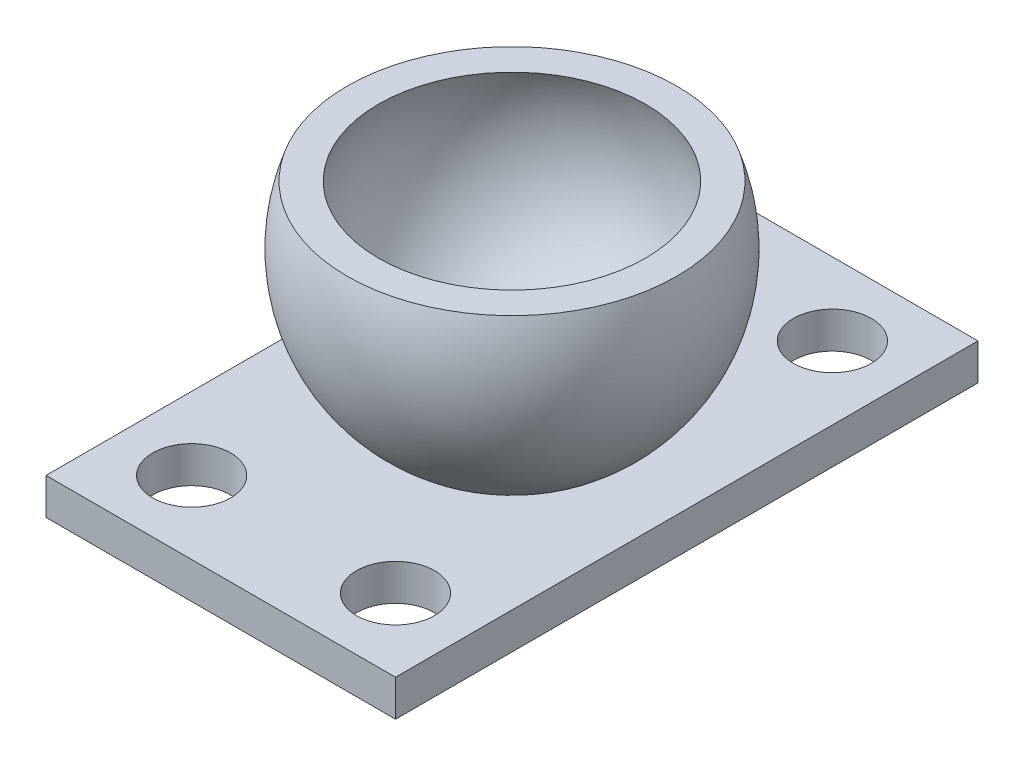
ISO-10303-21;
HEADER;
FILE_DESCRIPTION(('STEP AP214'),'2;1');
FILE_NAME('part.step','',(''),(''),'','','');
FILE_SCHEMA(('AUTOMOTIVE_DESIGN { 1 0 10303 214 1 1 1 1 }'));
ENDSEC;
DATA;
#1=APPLICATION_CONTEXT('core data for automotive mechanical design processes');
#2=APPLICATION_PROTOCOL_DEFINITION('international standard','automotive_design',2000,#1);
#3=PRODUCT_CONTEXT('',#1,'mechanical');
#4=PRODUCT('Part','Part','',(#3));
#5=PRODUCT_RELATED_PRODUCT_CATEGORY('part','',(#4));
#6=PRODUCT_DEFINITION_FORMATION('','',#4);
#7=PRODUCT_DEFINITION_CONTEXT('part definition',#1,'design');
#8=PRODUCT_DEFINITION('design','',#6,#7);
#9=PRODUCT_DEFINITION_SHAPE('','',#8);
#10=(LENGTH_UNIT() NAMED_UNIT(*) SI_UNIT(.MILLI.,.METRE.));
#11=(NAMED_UNIT(*) PLANE_ANGLE_UNIT() SI_UNIT($,.RADIAN.));
#12=(NAMED_UNIT(*) SI_UNIT($,.STERADIAN.) SOLID_ANGLE_UNIT());
#13=UNCERTAINTY_MEASURE_WITH_UNIT(LENGTH_MEASURE(1.E-05),#10,'distance_accuracy_value','');
#14=(GEOMETRIC_REPRESENTATION_CONTEXT(3) GLOBAL_UNCERTAINTY_ASSIGNED_CONTEXT((#13)) GLOBAL_UNIT_ASSIGNED_CONTEXT((#10,
#11,#12)) REPRESENTATION_CONTEXT('',''));
#15=CARTESIAN_POINT('',(0.,0.,0.));
#16=DIRECTION('',(0.,0.,1.));
#17=DIRECTION('',(1.,0.,0.));
#18=AXIS2_PLACEMENT_3D('',#15,#16,#17);
#19=CARTESIAN_POINT('',(0.,0.,0.));
#20=DIRECTION('',(0.,1.,0.));
#21=DIRECTION('',(1.,0.,0.));
#22=AXIS2_PLACEMENT_3D('',#19,#20,#21);
#23=SPHERICAL_SURFACE('',#22,7.62);
#24=CARTESIAN_POINT('',(0.,2.54,0.));
#25=DIRECTION('',(0.,-1.,0.));
#26=DIRECTION('',(0.,0.,-1.));
#27=AXIS2_PLACEMENT_3D('',#24,#25,#26);
#28=CIRCLE('',#27,7.18420489685532);
#29=CARTESIAN_POINT('',(7.18420489685532,2.54,0.));
#30=VERTEX_POINT('',#29);
#31=EDGE_CURVE('E41',#30,#30,#28,.T.);
#32=CARTESIAN_POINT('',(0.,-6.0325,0.));
#33=DIRECTION('',(0.,-1.,0.));
#34=DIRECTION('',(0.,0.,-1.));
#35=AXIS2_PLACEMENT_3D('',#32,#33,#34);
#36=CIRCLE('',#35,4.65546385981032);
#37=CARTESIAN_POINT('',(4.65546385981032,-6.0325,0.));
#38=VERTEX_POINT('',#37);
#39=EDGE_CURVE('E11',#38,#38,#36,.T.);
#40=CARTESIAN_POINT('',(7.18420489685532,2.54,0.));
#41=CARTESIAN_POINT('',(7.21736797864051,2.44620385762288,0.));
#42=CARTESIAN_POINT('',(7.24869215006212,2.35175763946825,0.));
#43=CARTESIAN_POINT('',(7.30761912540713,2.16171132039475,0.));
#44=CARTESIAN_POINT('',(7.33522192933052,2.06611121947588,0.));
#45=CARTESIAN_POINT('',(7.38666262290797,1.87390340366473,0.));
#46=CARTESIAN_POINT('',(7.41050051256203,1.77729568877244,0.));
#47=CARTESIAN_POINT('',(7.45437513543213,1.58322093366377,0.));
#48=CARTESIAN_POINT('',(7.47441186864817,1.48575389344739,0.));
#49=CARTESIAN_POINT('',(7.51065335730442,1.29010996739783,0.));
#50=CARTESIAN_POINT('',(7.52685811274463,1.19193308156466,0.));
#51=CARTESIAN_POINT('',(7.55541081227081,0.995020066884962,0.));
#52=CARTESIAN_POINT('',(7.56775875635677,0.896283938038443,0.));
#53=CARTESIAN_POINT('',(7.58857888620803,0.698403888645334,0.));
#54=CARTESIAN_POINT('',(7.59705107197332,0.599259968098743,0.));
#55=CARTESIAN_POINT('',(7.61010669120119,0.400716414582973,0.));
#56=CARTESIAN_POINT('',(7.61469012466378,0.301316781613794,0.));
#57=CARTESIAN_POINT('',(7.61996120822331,0.102414274117462,0.));
#58=CARTESIAN_POINT('',(7.62064885832025,0.00291139959030922,0.));
#59=CARTESIAN_POINT('',(7.61812732046847,-0.196044961617627,0.));
#60=CARTESIAN_POINT('',(7.61491813251974,-0.295498448298411,0.));
#61=CARTESIAN_POINT('',(7.60460784117947,-0.494203480213263,0.));
#62=CARTESIAN_POINT('',(7.59750673778794,-0.593455025447331,0.));
#63=CARTESIAN_POINT('',(7.57942350808932,-0.79160393061766,0.));
#64=CARTESIAN_POINT('',(7.56844138178224,-0.89050129055392,0.));
#65=CARTESIAN_POINT('',(7.54261295194434,-1.08779012457254,0.));
#66=CARTESIAN_POINT('',(7.52776664841354,-1.1861815986549,0.));
#67=CARTESIAN_POINT('',(7.49423263715848,-1.38230773639673,0.));
#68=CARTESIAN_POINT('',(7.47554492943423,-1.48004240005619,0.));
#69=CARTESIAN_POINT('',(7.43435677522536,-1.6747049998776,0.));
#70=CARTESIAN_POINT('',(7.41185632874073,-1.77163293603953,0.));
#71=CARTESIAN_POINT('',(7.36307721087747,-1.96453340124594,0.));
#72=CARTESIAN_POINT('',(7.33679853949883,-2.06050593029042,0.));
#73=CARTESIAN_POINT('',(7.28050328120545,-2.25134836715928,0.));
#74=CARTESIAN_POINT('',(7.25048669429071,-2.34621827498368,0.));
#75=CARTESIAN_POINT('',(7.18676164794341,-2.53470994664161,0.));
#76=CARTESIAN_POINT('',(7.15305318851084,-2.62833171047514,0.));
#77=CARTESIAN_POINT('',(7.08199610318013,-2.81418348593254,0.));
#78=CARTESIAN_POINT('',(7.04464747728199,-2.9064134975564,0.));
#79=CARTESIAN_POINT('',(6.96636734879371,-3.08934029521119,0.));
#80=CARTESIAN_POINT('',(6.92543584620356,-3.18003708124213,0.));
#81=CARTESIAN_POINT('',(6.84005274994753,-3.35975830617133,0.));
#82=CARTESIAN_POINT('',(6.79560115628166,-3.44878274506959,0.));
#83=CARTESIAN_POINT('',(6.70324606302764,-3.6250227194414,0.));
#84=CARTESIAN_POINT('',(6.65534256343949,-3.71223825491493,0.));
#85=CARTESIAN_POINT('',(6.55615713843175,-3.88472664084812,0.));
#86=CARTESIAN_POINT('',(6.50487521301215,-3.96999949130777,0.));
#87=CARTESIAN_POINT('',(6.39901159869178,-4.13847170557846,0.));
#88=CARTESIAN_POINT('',(6.34442990979101,-4.2216710693895,0.));
#89=CARTESIAN_POINT('',(6.23205049232719,-4.38586868916735,0.));
#90=CARTESIAN_POINT('',(6.17425276376414,-4.46686694513417,0.));
#91=CARTESIAN_POINT('',(6.05552992431975,-4.62653810480414,0.));
#92=CARTESIAN_POINT('',(5.99460481343841,-4.7052110085073,0.));
#93=CARTESIAN_POINT('',(5.86972066243425,-4.86011078443617,0.));
#94=CARTESIAN_POINT('',(5.80576162231144,-4.93633765666188,0.));
#95=CARTESIAN_POINT('',(5.67490772499867,-5.08622844876912,0.));
#96=CARTESIAN_POINT('',(5.60801286780871,-5.15989236865066,0.));
#97=CARTESIAN_POINT('',(5.47138993207991,-5.30454424293146,0.));
#98=CARTESIAN_POINT('',(5.40166185354106,-5.37553219733073,0.));
#99=CARTESIAN_POINT('',(5.25947949051871,-5.51472332042364,0.));
#100=CARTESIAN_POINT('',(5.18702520603521,-5.58292648911727,0.));
#101=CARTESIAN_POINT('',(5.03950135305579,-5.71644316304503,0.));
#102=CARTESIAN_POINT('',(4.96443178455988,-5.78175666827915,0.));
#103=CARTESIAN_POINT('',(4.81179332437503,-5.90939479851104,0.));
#104=CARTESIAN_POINT('',(4.73422443268609,-5.97171942350882,0.));
#105=CARTESIAN_POINT('',(4.65546385981032,-6.0325,0.));
#106=B_SPLINE_CURVE_WITH_KNOTS('',3,(#40,#41,#42,#43,#44,#45,#46,#47,#48,#49,#50,#51,#52,#53,
#54,#55,#56,#57,#58,#59,#60,#61,#62,#63,#64,#65,#66,#67,#68,#69,#70,#71,#72,#73,#74,#75,#76,#77,
#78,#79,#80,#81,#82,#83,#84,#85,#86,#87,#88,#89,#90,#91,#92,#93,#94,#95,#96,#97,#98,#99,#100,
#101,#102,#103,#104,#105),.UNSPECIFIED.,.F.,.F.,(4,2,2,2,2,2,2,2,2,2,2,2,2,2,2,2,2,2,2,2,2,2,2,
2,2,2,2,2,2,2,2,2,4),(0.,0.298439435349034,0.596878870698068,0.895318306047103,1.19375774139614,
1.49219717674517,1.79063661209421,2.08907604744324,2.38751548279227,2.68595491814131,
2.98439435349034,3.28283378883938,3.58127322418841,3.87971265953745,4.17815209488648,
4.47659153023552,4.77503096558455,5.07347040093358,5.37190983628262,5.67034927163165,
5.96878870698068,6.26722814232972,6.56566757767875,6.86410701302779,7.16254644837682,
7.46098588372586,7.75942531907489,8.05786475442392,8.35630418977296,8.65474362512199,
8.95318306047103,9.25162249582006,9.5500619311691),.UNSPECIFIED.);
#107=EDGE_CURVE('BSEAM33',#30,#38,#106,.T.);
#108=ORIENTED_EDGE('',*,*,#31,.T.);
#109=ORIENTED_EDGE('',*,*,#39,.F.);
#110=ORIENTED_EDGE('',*,*,#107,.T.);
#111=ORIENTED_EDGE('',*,*,#107,.F.);
#112=EDGE_LOOP('',(#108,#110,#109,#111));
#113=FACE_BOUND('',#112,.T.);
#114=ADVANCED_FACE('F33',(#113),#23,.T.);
#115=CARTESIAN_POINT('',(0.,0.,0.));
#116=DIRECTION('',(0.,1.,0.));
#117=DIRECTION('',(1.,0.,0.));
#118=AXIS2_PLACEMENT_3D('',#115,#116,#117);
#119=SPHERICAL_SURFACE('',#118,6.35);
#120=CARTESIAN_POINT('',(0.,2.54,0.));
#121=DIRECTION('',(0.,-1.,0.));
#122=DIRECTION('',(0.,0.,-1.));
#123=AXIS2_PLACEMENT_3D('',#120,#121,#122);
#124=CIRCLE('',#123,5.81987113259392);
#125=CARTESIAN_POINT('',(5.81987113259392,2.54,0.));
#126=VERTEX_POINT('',#125);
#127=EDGE_CURVE('E116',#126,#126,#124,.T.);
#128=CARTESIAN_POINT('',(0.,-6.0325,0.));
#129=DIRECTION('',(0.,-1.,0.));
#130=DIRECTION('',(0.,0.,-1.));
#131=AXIS2_PLACEMENT_3D('',#128,#129,#130);
#132=CIRCLE('',#131,1.98278686449149);
#133=CARTESIAN_POINT('',(1.98278686449149,-6.0325,0.));
#134=VERTEX_POINT('',#133);
#135=EDGE_CURVE('E36',#134,#134,#132,.T.);
#136=CARTESIAN_POINT('',(5.81987113259392,2.54,0.));
#137=CARTESIAN_POINT('',(5.86392031976895,2.43907758312545,0.));
#138=CARTESIAN_POINT('',(5.90533920572225,2.33700748226285,0.));
#139=CARTESIAN_POINT('',(5.98281574346039,2.13085239739143,0.));
#140=CARTESIAN_POINT('',(6.01887339524525,2.02676741338262,0.));
#141=CARTESIAN_POINT('',(6.08552683292156,1.81686304704869,0.));
#142=CARTESIAN_POINT('',(6.11612261881302,1.71104366472358,0.));
#143=CARTESIAN_POINT('',(6.17177035893245,1.4979571404296,0.));
#144=CARTESIAN_POINT('',(6.19682231316042,1.39068999846072,0.));
#145=CARTESIAN_POINT('',(6.2413143833568,1.1749981195208,0.));
#146=CARTESIAN_POINT('',(6.26075449932521,1.06657338254976,0.));
#147=CARTESIAN_POINT('',(6.29397035020064,0.848859715393923,0.));
#148=CARTESIAN_POINT('',(6.30774608510765,0.739570785209135,0.));
#149=CARTESIAN_POINT('',(6.32959588316977,0.520424443676335,0.));
#150=CARTESIAN_POINT('',(6.33766994632487,0.410567032328323,0.));
#151=CARTESIAN_POINT('',(6.34809455802168,0.190580986267072,0.));
#152=CARTESIAN_POINT('',(6.35044510656338,0.0804523515538311,0.));
#153=CARTESIAN_POINT('',(6.3494163276985,-0.139778151571515,0.));
#154=CARTESIAN_POINT('',(6.34603700029191,-0.249880019983621,0.));
#155=CARTESIAN_POINT('',(6.33355761374231,-0.469759072724919,0.));
#156=CARTESIAN_POINT('',(6.32445755459929,-0.579536257054111,0.));
#157=CARTESIAN_POINT('',(6.30056132776863,-0.798468902534753,0.));
#158=CARTESIAN_POINT('',(6.28576516008099,-0.907624363686202,0.));
#159=CARTESIAN_POINT('',(6.25051675219531,-1.12501820595905,0.));
#160=CARTESIAN_POINT('',(6.23006451199725,-1.23325658708045,0.));
#161=CARTESIAN_POINT('',(6.18355929950538,-1.44852339392004,0.));
#162=CARTESIAN_POINT('',(6.15750632721155,-1.55555181963821,0.));
#163=CARTESIAN_POINT('',(6.09987014561621,-1.76810911423703,0.));
#164=CARTESIAN_POINT('',(6.06828693631469,-1.87363798311766,0.));
#165=CARTESIAN_POINT('',(5.99967573970785,-2.08291062016362,0.));
#166=CARTESIAN_POINT('',(5.96264775240252,-2.18665438832894,0.));
#167=CARTESIAN_POINT('',(5.88324719147222,-2.39207611025718,0.));
#168=CARTESIAN_POINT('',(5.84087461784725,-2.4937540640201,0.));
#169=CARTESIAN_POINT('',(5.75089953753902,-2.69476903321278,0.));
#170=CARTESIAN_POINT('',(5.70329703085576,-2.79410604864253,0.));
#171=CARTESIAN_POINT('',(5.60299088903681,-2.99017035143477,0.));
#172=CARTESIAN_POINT('',(5.55028725390112,-3.08689763879726,0.));
#173=CARTESIAN_POINT('',(5.4399214626032,-3.27748075721853,0.));
#174=CARTESIAN_POINT('',(5.38225930644099,-3.37133658827731,0.));
#175=CARTESIAN_POINT('',(5.26213249746397,-3.55592283554686,0.));
#176=CARTESIAN_POINT('',(5.19966784464916,-3.64665325175764,0.));
#177=CARTESIAN_POINT('',(5.07010506151141,-3.82474316764684,0.));
#178=CARTESIAN_POINT('',(5.00300693118847,-3.91210266732528,0.));
#179=CARTESIAN_POINT('',(4.86435874961491,-4.08321436962226,0.));
#180=CARTESIAN_POINT('',(4.79280869836428,-4.16696657224081,0.));
#181=CARTESIAN_POINT('',(4.64545027767578,-4.3306370606194,0.));
#182=CARTESIAN_POINT('',(4.56964190823791,-4.41055534637944,0.));
#183=CARTESIAN_POINT('',(4.41397197626852,-4.56634175529791,0.));
#184=CARTESIAN_POINT('',(4.334110413737,-4.64220987845633,0.));
#185=CARTESIAN_POINT('',(4.17055018780346,-4.78969067512276,0.));
#186=CARTESIAN_POINT('',(4.08685152440143,-4.86130334863076,0.));
#187=CARTESIAN_POINT('',(3.91584357207322,-5.0000794749321,0.));
#188=CARTESIAN_POINT('',(3.82853428314703,-5.06724292772543,0.));
#189=CARTESIAN_POINT('',(3.65054132280778,-5.19693887504929,0.));
#190=CARTESIAN_POINT('',(3.55985765139471,-5.25947136957983,0.));
#191=CARTESIAN_POINT('',(3.37536130737882,-5.37973621340623,0.));
#192=CARTESIAN_POINT('',(3.281548634776,-5.43746856270211,0.));
#193=CARTESIAN_POINT('',(3.09104810738704,-5.54797684300508,0.));
#194=CARTESIAN_POINT('',(2.9943602526009,-5.60075277401217,0.));
#195=CARTESIAN_POINT('',(2.79837106731956,-5.70120563394583,0.));
#196=CARTESIAN_POINT('',(2.69906973682437,-5.74888256287239,0.));
#197=CARTESIAN_POINT('',(2.49812197631587,-5.83900759439379,0.));
#198=CARTESIAN_POINT('',(2.39647554630257,-5.88145569698864,0.));
#199=CARTESIAN_POINT('',(2.19111380839673,-5.96101127204487,0.));
#200=CARTESIAN_POINT('',(2.0873985005042,-5.99811874450624,0.));
#201=CARTESIAN_POINT('',(1.98278686449149,-6.0325,0.));
#202=B_SPLINE_CURVE_WITH_KNOTS('',3,(#136,#137,#138,#139,#140,#141,#142,#143,#144,#145,#146,
#147,#148,#149,#150,#151,#152,#153,#154,#155,#156,#157,#158,#159,#160,#161,#162,#163,#164,#165,
#166,#167,#168,#169,#170,#171,#172,#173,#174,#175,#176,#177,#178,#179,#180,#181,#182,#183,#184,
#185,#186,#187,#188,#189,#190,#191,#192,#193,#194,#195,#196,#197,#198,#199,#200,#201),
.UNSPECIFIED.,.F.,.F.,(4,2,2,2,2,2,2,2,2,2,2,2,2,2,2,2,2,2,2,2,2,2,2,2,2,2,2,2,2,2,2,2,4),(0.,
0.330312120768517,0.660624241537033,0.990936362305549,1.32124848307407,1.65156060384258,
1.9818727246111,2.31218484537962,2.64249696614813,2.97280908691665,3.30312120768517,
3.63343332845368,3.9637454492222,4.29405756999071,4.62436969075923,4.95468181152775,
5.28499393229626,5.61530605306478,5.9456181738333,6.27593029460181,6.60624241537033,
6.93655453613885,7.26686665690736,7.59717877767588,7.92749089844439,8.25780301921291,
8.58811513998143,8.91842726074994,9.24873938151846,9.57905150228698,9.9093636230555,
10.239675743824,10.5699878645925),.UNSPECIFIED.);
#203=EDGE_CURVE('BSEAM126',#126,#134,#202,.T.);
#204=ORIENTED_EDGE('',*,*,#127,.F.);
#205=ORIENTED_EDGE('',*,*,#135,.T.);
#206=ORIENTED_EDGE('',*,*,#203,.T.);
#207=ORIENTED_EDGE('',*,*,#203,.F.);
#208=EDGE_LOOP('',(#204,#206,#205,#207));
#209=FACE_BOUND('',#208,.T.);
#210=ADVANCED_FACE('F126',(#209),#119,.F.);
#211=CARTESIAN_POINT('',(-8.89,2.54,-12.7));
#212=DIRECTION('',(0.,-1.,0.));
#213=DIRECTION('',(0.,0.,-1.));
#214=AXIS2_PLACEMENT_3D('',#211,#212,#213);
#215=PLANE('',#214);
#216=ORIENTED_EDGE('',*,*,#127,.T.);
#217=EDGE_LOOP('',(#216));
#218=FACE_BOUND('',#217,.T.);
#219=ORIENTED_EDGE('',*,*,#31,.F.);
#220=EDGE_LOOP('',(#219));
#221=FACE_BOUND('',#220,.T.);
#222=ADVANCED_FACE('F123',(#218,#221),#215,.F.);
#223=CARTESIAN_POINT('',(0.,-6.0325,0.));
#224=DIRECTION('',(0.,-1.,0.));
#225=DIRECTION('',(0.,0.,-1.));
#226=AXIS2_PLACEMENT_3D('',#223,#224,#225);
#227=PLANE('',#226);
#228=ORIENTED_EDGE('',*,*,#135,.F.);
#229=EDGE_LOOP('',(#228));
#230=FACE_BOUND('',#229,.T.);
#231=ADVANCED_FACE('F125',(#230),#227,.F.);
#232=CARTESIAN_POINT('',(-7.62,-6.0325,12.7));
#233=DIRECTION('',(1.,0.,0.));
#234=DIRECTION('',(0.,0.,-1.));
#235=AXIS2_PLACEMENT_3D('',#232,#233,#234);
#236=PLANE('',#235);
#237=DIRECTION('',(0.,0.,1.));
#238=VECTOR('',#237,1.);
#239=CARTESIAN_POINT('',(-7.62,-7.62,12.7));
#240=LINE('',#239,#238);
#241=CARTESIAN_POINT('',(-7.62,-7.62,-12.7));
#242=VERTEX_POINT('',#241);
#243=CARTESIAN_POINT('',(-7.62,-7.62,12.7));
#244=VERTEX_POINT('',#243);
#245=EDGE_CURVE('E105',#242,#244,#240,.T.);
#246=ORIENTED_EDGE('',*,*,#245,.T.);
#247=DIRECTION('',(0.,-1.,0.));
#248=VECTOR('',#247,1.);
#249=CARTESIAN_POINT('',(-7.62,-6.0325,12.7));
#250=LINE('',#249,#248);
#251=CARTESIAN_POINT('',(-7.62,-6.0325,12.7));
#252=VERTEX_POINT('',#251);
#253=EDGE_CURVE('E96',#252,#244,#250,.T.);
#254=ORIENTED_EDGE('',*,*,#253,.F.);
#255=DIRECTION('',(0.,0.,1.));
#256=VECTOR('',#255,1.);
#257=CARTESIAN_POINT('',(-7.62,-6.0325,12.7));
#258=LINE('',#257,#256);
#259=CARTESIAN_POINT('',(-7.62,-6.0325,-12.7));
#260=VERTEX_POINT('',#259);
#261=EDGE_CURVE('E87',#260,#252,#258,.T.);
#262=ORIENTED_EDGE('',*,*,#261,.F.);
#263=DIRECTION('',(0.,-1.,0.));
#264=VECTOR('',#263,1.);
#265=CARTESIAN_POINT('',(-7.62,-6.0325,-12.7));
#266=LINE('',#265,#264);
#267=EDGE_CURVE('E101',#260,#242,#266,.T.);
#268=ORIENTED_EDGE('',*,*,#267,.T.);
#269=EDGE_LOOP('',(#246,#254,#262,#268));
#270=FACE_BOUND('',#269,.T.);
#271=ADVANCED_FACE('F132',(#270),#236,.F.);
#272=CARTESIAN_POINT('',(-7.62,-6.0325,12.7));
#273=DIRECTION('',(0.,0.,-1.));
#274=DIRECTION('',(-1.,0.,0.));
#275=AXIS2_PLACEMENT_3D('',#272,#273,#274);
#276=PLANE('',#275);
#277=DIRECTION('',(1.,0.,0.));
#278=VECTOR('',#277,1.);
#279=CARTESIAN_POINT('',(-7.62,-7.62,12.7));
#280=LINE('',#279,#278);
#281=CARTESIAN_POINT('',(7.62,-7.62,12.7));
#282=VERTEX_POINT('',#281);
#283=EDGE_CURVE('E93',#244,#282,#280,.T.);
#284=ORIENTED_EDGE('',*,*,#283,.T.);
#285=DIRECTION('',(0.,-1.,0.));
#286=VECTOR('',#285,1.);
#287=CARTESIAN_POINT('',(7.62,-6.0325,12.7));
#288=LINE('',#287,#286);
#289=CARTESIAN_POINT('',(7.62,-6.0325,12.7));
#290=VERTEX_POINT('',#289);
#291=EDGE_CURVE('E91',#290,#282,#288,.T.);
#292=ORIENTED_EDGE('',*,*,#291,.F.);
#293=DIRECTION('',(1.,0.,0.));
#294=VECTOR('',#293,1.);
#295=CARTESIAN_POINT('',(-7.62,-6.0325,12.7));
#296=LINE('',#295,#294);
#297=EDGE_CURVE('E81',#252,#290,#296,.T.);
#298=ORIENTED_EDGE('',*,*,#297,.F.);
#299=ORIENTED_EDGE('',*,*,#253,.T.);
#300=EDGE_LOOP('',(#284,#292,#298,#299));
#301=FACE_BOUND('',#300,.T.);
#302=ADVANCED_FACE('F92',(#301),#276,.F.);
#303=CARTESIAN_POINT('',(7.62,-6.0325,12.7));
#304=DIRECTION('',(-1.,0.,0.));
#305=DIRECTION('',(0.,0.,1.));
#306=AXIS2_PLACEMENT_3D('',#303,#304,#305);
#307=PLANE('',#306);
#308=DIRECTION('',(0.,0.,-1.));
#309=VECTOR('',#308,1.);
#310=CARTESIAN_POINT('',(7.62,-7.62,12.7));
#311=LINE('',#310,#309);
#312=CARTESIAN_POINT('',(7.62,-7.62,-12.7));
#313=VERTEX_POINT('',#312);
#314=EDGE_CURVE('E110',#282,#313,#311,.T.);
#315=ORIENTED_EDGE('',*,*,#314,.T.);
#316=DIRECTION('',(0.,-1.,0.));
#317=VECTOR('',#316,1.);
#318=CARTESIAN_POINT('',(7.62,-6.0325,-12.7));
#319=LINE('',#318,#317);
#320=CARTESIAN_POINT('',(7.62,-6.0325,-12.7));
#321=VERTEX_POINT('',#320);
#322=EDGE_CURVE('E97',#321,#313,#319,.T.);
#323=ORIENTED_EDGE('',*,*,#322,.F.);
#324=DIRECTION('',(0.,0.,-1.));
#325=VECTOR('',#324,1.);
#326=CARTESIAN_POINT('',(7.62,-6.0325,12.7));
#327=LINE('',#326,#325);
#328=EDGE_CURVE('E84',#290,#321,#327,.T.);
#329=ORIENTED_EDGE('',*,*,#328,.F.);
#330=ORIENTED_EDGE('',*,*,#291,.T.);
#331=EDGE_LOOP('',(#315,#323,#329,#330));
#332=FACE_BOUND('',#331,.T.);
#333=ADVANCED_FACE('F99',(#332),#307,.F.);
#334=CARTESIAN_POINT('',(-7.62,-6.0325,-12.7));
#335=DIRECTION('',(0.,0.,1.));
#336=DIRECTION('',(1.,0.,0.));
#337=AXIS2_PLACEMENT_3D('',#334,#335,#336);
#338=PLANE('',#337);
#339=DIRECTION('',(-1.,0.,0.));
#340=VECTOR('',#339,1.);
#341=CARTESIAN_POINT('',(-7.62,-7.62,-12.7));
#342=LINE('',#341,#340);
#343=EDGE_CURVE('E73',#313,#242,#342,.T.);
#344=ORIENTED_EDGE('',*,*,#343,.T.);
#345=ORIENTED_EDGE('',*,*,#267,.F.);
#346=DIRECTION('',(-1.,0.,0.));
#347=VECTOR('',#346,1.);
#348=CARTESIAN_POINT('',(-7.62,-6.0325,-12.7));
#349=LINE('',#348,#347);
#350=EDGE_CURVE('E53',#321,#260,#349,.T.);
#351=ORIENTED_EDGE('',*,*,#350,.F.);
#352=ORIENTED_EDGE('',*,*,#322,.T.);
#353=EDGE_LOOP('',(#344,#345,#351,#352));
#354=FACE_BOUND('',#353,.T.);
#355=ADVANCED_FACE('F178',(#354),#338,.F.);
#356=CARTESIAN_POINT('',(-4.445,-6.0325,9.525));
#357=DIRECTION('',(0.,1.,0.));
#358=DIRECTION('',(0.,0.,1.));
#359=AXIS2_PLACEMENT_3D('',#356,#357,#358);
#360=CIRCLE('',#359,1.7);
#361=CARTESIAN_POINT('',(-4.445,-6.0325,11.225));
#362=VERTEX_POINT('',#361);
#363=EDGE_CURVE('E254',#362,#362,#360,.T.);
#364=ORIENTED_EDGE('',*,*,#363,.F.);
#365=EDGE_LOOP('',(#364));
#366=FACE_BOUND('',#365,.T.);
#367=CARTESIAN_POINT('',(-4.445,-6.0325,-9.525));
#368=DIRECTION('',(0.,1.,0.));
#369=DIRECTION('',(0.,0.,1.));
#370=AXIS2_PLACEMENT_3D('',#367,#368,#369);
#371=CIRCLE('',#370,1.7);
#372=CARTESIAN_POINT('',(-4.445,-6.0325,-7.825));
#373=VERTEX_POINT('',#372);
#374=EDGE_CURVE('E256',#373,#373,#371,.T.);
#375=ORIENTED_EDGE('',*,*,#374,.F.);
#376=EDGE_LOOP('',(#375));
#377=FACE_BOUND('',#376,.T.);
#378=CARTESIAN_POINT('',(4.445,-6.0325,-9.525));
#379=DIRECTION('',(0.,1.,0.));
#380=DIRECTION('',(0.,0.,1.));
#381=AXIS2_PLACEMENT_3D('',#378,#379,#380);
#382=CIRCLE('',#381,1.7);
#383=CARTESIAN_POINT('',(4.445,-6.0325,-7.825));
#384=VERTEX_POINT('',#383);
#385=EDGE_CURVE('E264',#384,#384,#382,.T.);
#386=ORIENTED_EDGE('',*,*,#385,.F.);
#387=EDGE_LOOP('',(#386));
#388=FACE_BOUND('',#387,.T.);
#389=CARTESIAN_POINT('',(4.445,-6.0325,9.525));
#390=DIRECTION('',(0.,1.,0.));
#391=DIRECTION('',(0.,0.,1.));
#392=AXIS2_PLACEMENT_3D('',#389,#390,#391);
#393=CIRCLE('',#392,1.7);
#394=CARTESIAN_POINT('',(4.445,-6.0325,11.225));
#395=VERTEX_POINT('',#394);
#396=EDGE_CURVE('E270',#395,#395,#393,.T.);
#397=ORIENTED_EDGE('',*,*,#396,.F.);
#398=EDGE_LOOP('',(#397));
#399=FACE_BOUND('',#398,.T.);
#400=ORIENTED_EDGE('',*,*,#39,.T.);
#401=EDGE_LOOP('',(#400));
#402=FACE_BOUND('',#401,.T.);
#403=ORIENTED_EDGE('',*,*,#261,.T.);
#404=ORIENTED_EDGE('',*,*,#297,.T.);
#405=ORIENTED_EDGE('',*,*,#328,.T.);
#406=ORIENTED_EDGE('',*,*,#350,.T.);
#407=EDGE_LOOP('',(#403,#404,#405,#406));
#408=FACE_BOUND('',#407,.T.);
#409=ADVANCED_FACE('F82',(#366,#377,#388,#399,#402,#408),#227,.F.);
#410=CARTESIAN_POINT('',(0.,-7.62,0.));
#411=DIRECTION('',(0.,-1.,0.));
#412=DIRECTION('',(0.,0.,-1.));
#413=AXIS2_PLACEMENT_3D('',#410,#411,#412);
#414=PLANE('',#413);
#415=CARTESIAN_POINT('',(-4.445,-7.62,9.525));
#416=DIRECTION('',(0.,1.,0.));
#417=DIRECTION('',(0.,0.,1.));
#418=AXIS2_PLACEMENT_3D('',#415,#416,#417);
#419=CIRCLE('',#418,1.7);
#420=CARTESIAN_POINT('',(-4.445,-7.62,11.225));
#421=VERTEX_POINT('',#420);
#422=EDGE_CURVE('E251',#421,#421,#419,.T.);
#423=ORIENTED_EDGE('',*,*,#422,.T.);
#424=EDGE_LOOP('',(#423));
#425=FACE_BOUND('',#424,.T.);
#426=CARTESIAN_POINT('',(-4.445,-7.62,-9.525));
#427=DIRECTION('',(0.,1.,0.));
#428=DIRECTION('',(0.,0.,1.));
#429=AXIS2_PLACEMENT_3D('',#426,#427,#428);
#430=CIRCLE('',#429,1.7);
#431=CARTESIAN_POINT('',(-4.445,-7.62,-7.825));
#432=VERTEX_POINT('',#431);
#433=EDGE_CURVE('E261',#432,#432,#430,.T.);
#434=ORIENTED_EDGE('',*,*,#433,.T.);
#435=EDGE_LOOP('',(#434));
#436=FACE_BOUND('',#435,.T.);
#437=CARTESIAN_POINT('',(4.445,-7.62,-9.525));
#438=DIRECTION('',(0.,1.,0.));
#439=DIRECTION('',(0.,0.,1.));
#440=AXIS2_PLACEMENT_3D('',#437,#438,#439);
#441=CIRCLE('',#440,1.7);
#442=CARTESIAN_POINT('',(4.445,-7.62,-7.825));
#443=VERTEX_POINT('',#442);
#444=EDGE_CURVE('E267',#443,#443,#441,.T.);
#445=ORIENTED_EDGE('',*,*,#444,.T.);
#446=EDGE_LOOP('',(#445));
#447=FACE_BOUND('',#446,.T.);
#448=CARTESIAN_POINT('',(4.445,-7.62,9.525));
#449=DIRECTION('',(0.,1.,0.));
#450=DIRECTION('',(0.,0.,1.));
#451=AXIS2_PLACEMENT_3D('',#448,#449,#450);
#452=CIRCLE('',#451,1.7);
#453=CARTESIAN_POINT('',(4.445,-7.62,11.225));
#454=VERTEX_POINT('',#453);
#455=EDGE_CURVE('E108',#454,#454,#452,.T.);
#456=ORIENTED_EDGE('',*,*,#455,.T.);
#457=EDGE_LOOP('',(#456));
#458=FACE_BOUND('',#457,.T.);
#459=CARTESIAN_POINT('',(0.,-7.62,0.));
#460=VERTEX_POINT('',#459);
#461=VERTEX_LOOP('',#460);
#462=FACE_BOUND('',#461,.T.);
#463=ORIENTED_EDGE('',*,*,#245,.F.);
#464=ORIENTED_EDGE('',*,*,#343,.F.);
#465=ORIENTED_EDGE('',*,*,#314,.F.);
#466=ORIENTED_EDGE('',*,*,#283,.F.);
#467=EDGE_LOOP('',(#463,#464,#465,#466));
#468=FACE_BOUND('',#467,.T.);
#469=ADVANCED_FACE('F195',(#425,#436,#447,#458,#462,#468),#414,.T.);
#470=CARTESIAN_POINT('',(4.445,-6.0325,9.525));
#471=DIRECTION('',(0.,1.,0.));
#472=DIRECTION('',(0.,0.,1.));
#473=AXIS2_PLACEMENT_3D('',#470,#471,#472);
#474=CYLINDRICAL_SURFACE('',#473,1.7);
#475=ORIENTED_EDGE('',*,*,#455,.F.);
#476=EDGE_LOOP('',(#475));
#477=FACE_BOUND('',#476,.T.);
#478=ORIENTED_EDGE('',*,*,#396,.T.);
#479=EDGE_LOOP('',(#478));
#480=FACE_BOUND('',#479,.T.);
#481=ADVANCED_FACE('F204',(#477,#480),#474,.F.);
#482=CARTESIAN_POINT('',(4.445,-6.0325,-9.525));
#483=DIRECTION('',(0.,1.,0.));
#484=DIRECTION('',(0.,0.,1.));
#485=AXIS2_PLACEMENT_3D('',#482,#483,#484);
#486=CYLINDRICAL_SURFACE('',#485,1.7);
#487=ORIENTED_EDGE('',*,*,#444,.F.);
#488=EDGE_LOOP('',(#487));
#489=FACE_BOUND('',#488,.T.);
#490=ORIENTED_EDGE('',*,*,#385,.T.);
#491=EDGE_LOOP('',(#490));
#492=FACE_BOUND('',#491,.T.);
#493=ADVANCED_FACE('F214',(#489,#492),#486,.F.);
#494=CARTESIAN_POINT('',(-4.445,-6.0325,-9.525));
#495=DIRECTION('',(0.,1.,0.));
#496=DIRECTION('',(0.,0.,1.));
#497=AXIS2_PLACEMENT_3D('',#494,#495,#496);
#498=CYLINDRICAL_SURFACE('',#497,1.7);
#499=ORIENTED_EDGE('',*,*,#433,.F.);
#500=EDGE_LOOP('',(#499));
#501=FACE_BOUND('',#500,.T.);
#502=ORIENTED_EDGE('',*,*,#374,.T.);
#503=EDGE_LOOP('',(#502));
#504=FACE_BOUND('',#503,.T.);
#505=ADVANCED_FACE('F224',(#501,#504),#498,.F.);
#506=CARTESIAN_POINT('',(-4.445,-6.0325,9.525));
#507=DIRECTION('',(0.,1.,0.));
#508=DIRECTION('',(0.,0.,1.));
#509=AXIS2_PLACEMENT_3D('',#506,#507,#508);
#510=CYLINDRICAL_SURFACE('',#509,1.7);
#511=ORIENTED_EDGE('',*,*,#422,.F.);
#512=EDGE_LOOP('',(#511));
#513=FACE_BOUND('',#512,.T.);
#514=ORIENTED_EDGE('',*,*,#363,.T.);
#515=EDGE_LOOP('',(#514));
#516=FACE_BOUND('',#515,.T.);
#517=ADVANCED_FACE('F234',(#513,#516),#510,.F.);
#518=CLOSED_SHELL('',(#114,#210,#222,#231,#271,#302,#333,#355,#409,#469,#481,#493,#505,#517));
#519=MANIFOLD_SOLID_BREP('B2',#518);
#520=ADVANCED_BREP_SHAPE_REPRESENTATION('',(#18,#519),#14);
#521=SHAPE_DEFINITION_REPRESENTATION(#9,#520);
ENDSEC;
END-ISO-10303-21;
